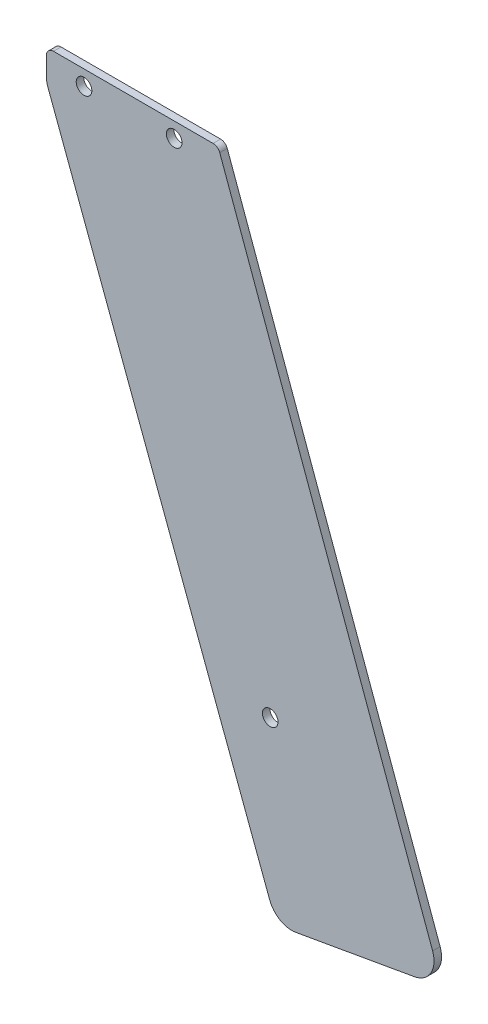
ISO-10303-21;
HEADER;
FILE_DESCRIPTION(('STEP AP214'),'2;1');
FILE_NAME('part.step','',(''),(''),'','','');
FILE_SCHEMA(('AUTOMOTIVE_DESIGN { 1 0 10303 214 1 1 1 1 }'));
ENDSEC;
DATA;
#1=APPLICATION_CONTEXT('core data for automotive mechanical design processes');
#2=APPLICATION_PROTOCOL_DEFINITION('international standard','automotive_design',2000,#1);
#3=PRODUCT_CONTEXT('',#1,'mechanical');
#4=PRODUCT('Part','Part','',(#3));
#5=PRODUCT_RELATED_PRODUCT_CATEGORY('part','',(#4));
#6=PRODUCT_DEFINITION_FORMATION('','',#4);
#7=PRODUCT_DEFINITION_CONTEXT('part definition',#1,'design');
#8=PRODUCT_DEFINITION('design','',#6,#7);
#9=PRODUCT_DEFINITION_SHAPE('','',#8);
#10=(LENGTH_UNIT() NAMED_UNIT(*) SI_UNIT(.MILLI.,.METRE.));
#11=(NAMED_UNIT(*) PLANE_ANGLE_UNIT() SI_UNIT($,.RADIAN.));
#12=(NAMED_UNIT(*) SI_UNIT($,.STERADIAN.) SOLID_ANGLE_UNIT());
#13=UNCERTAINTY_MEASURE_WITH_UNIT(LENGTH_MEASURE(1.E-05),#10,'distance_accuracy_value','');
#14=(GEOMETRIC_REPRESENTATION_CONTEXT(3) GLOBAL_UNCERTAINTY_ASSIGNED_CONTEXT((#13)) GLOBAL_UNIT_ASSIGNED_CONTEXT((#10,
#11,#12)) REPRESENTATION_CONTEXT('',''));
#15=CARTESIAN_POINT('',(0.,0.,0.));
#16=DIRECTION('',(0.,0.,1.));
#17=DIRECTION('',(1.,0.,0.));
#18=AXIS2_PLACEMENT_3D('',#15,#16,#17);
#19=CARTESIAN_POINT('',(0.,0.,3.175));
#20=DIRECTION('',(0.,0.,1.));
#21=DIRECTION('',(1.,0.,0.));
#22=AXIS2_PLACEMENT_3D('',#19,#20,#21);
#23=PLANE('',#22);
#24=CARTESIAN_POINT('',(94.5359337797207,-191.691292202923,3.175));
#25=DIRECTION('',(0.,0.,1.));
#26=DIRECTION('',(1.,0.,0.));
#27=AXIS2_PLACEMENT_3D('',#24,#25,#26);
#28=CIRCLE('',#27,3.3);
#29=CARTESIAN_POINT('',(97.8359337797207,-191.691292202923,3.175));
#30=VERTEX_POINT('',#29);
#31=EDGE_CURVE('E283',#30,#30,#28,.T.);
#32=ORIENTED_EDGE('',*,*,#31,.F.);
#33=EDGE_LOOP('',(#32));
#34=FACE_BOUND('',#33,.T.);
#35=CARTESIAN_POINT('',(53.9750000000011,0.,3.175));
#36=DIRECTION('',(0.,0.,1.));
#37=DIRECTION('',(1.,0.,0.));
#38=AXIS2_PLACEMENT_3D('',#35,#36,#37);
#39=CIRCLE('',#38,3.3);
#40=CARTESIAN_POINT('',(57.2750000000011,0.,3.175));
#41=VERTEX_POINT('',#40);
#42=EDGE_CURVE('E152',#41,#41,#39,.T.);
#43=ORIENTED_EDGE('',*,*,#42,.F.);
#44=EDGE_LOOP('',(#43));
#45=FACE_BOUND('',#44,.T.);
#46=DIRECTION('',(-1.,0.,0.));
#47=VECTOR('',#46,1.);
#48=CARTESIAN_POINT('',(72.4999999999932,6.34999999999678,3.175));
#49=LINE('',#48,#47);
#50=CARTESIAN_POINT('',(70.399377385364,6.34999999999677,3.175));
#51=VERTEX_POINT('',#50);
#52=CARTESIAN_POINT('',(3.00000000000095,6.34999999999661,3.175));
#53=VERTEX_POINT('',#52);
#54=EDGE_CURVE('E165',#51,#53,#49,.T.);
#55=ORIENTED_EDGE('',*,*,#54,.T.);
#56=CARTESIAN_POINT('',(3.00000000000096,3.34999999999661,3.175));
#57=DIRECTION('',(0.,0.,1.));
#58=DIRECTION('',(1.,0.,0.));
#59=AXIS2_PLACEMENT_3D('',#56,#57,#58);
#60=CIRCLE('',#59,3.);
#61=CARTESIAN_POINT('',(9.55600428183773E-13,3.34999999999656,3.175));
#62=VERTEX_POINT('',#61);
#63=EDGE_CURVE('E176',#53,#62,#60,.T.);
#64=ORIENTED_EDGE('',*,*,#63,.T.);
#65=DIRECTION('',(0.,-1.,0.));
#66=VECTOR('',#65,1.);
#67=CARTESIAN_POINT('',(9.0205620750794E-13,6.3499999999966,3.175));
#68=LINE('',#67,#66);
#69=CARTESIAN_POINT('',(1.09643577434151E-12,-4.54078696338335,3.175));
#70=VERTEX_POINT('',#69);
#71=EDGE_CURVE('E136',#62,#70,#68,.T.);
#72=ORIENTED_EDGE('',*,*,#71,.T.);
#73=CARTESIAN_POINT('',(10.0000000000011,-4.54078696338317,3.175));
#74=DIRECTION('',(0.,0.,1.));
#75=DIRECTION('',(1.,0.,0.));
#76=AXIS2_PLACEMENT_3D('',#73,#74,#75);
#77=CIRCLE('',#76,10.);
#78=CARTESIAN_POINT('',(0.633901180497817,-8.04452680864848,3.175));
#79=VERTEX_POINT('',#78);
#80=EDGE_CURVE('E177',#70,#79,#77,.T.);
#81=ORIENTED_EDGE('',*,*,#80,.T.);
#82=DIRECTION('',(0.350373984526517,-0.93660988195033,0.));
#83=VECTOR('',#82,1.);
#84=CARTESIAN_POINT('',(97.2444945958238,-266.301248169282,3.175));
#85=LINE('',#84,#83);
#86=CARTESIAN_POINT('',(94.3309920420975,-258.512955078415,3.175));
#87=VERTEX_POINT('',#86);
#88=EDGE_CURVE('E205',#79,#87,#85,.T.);
#89=ORIENTED_EDGE('',*,*,#88,.T.);
#90=CARTESIAN_POINT('',(103.697090861601,-255.00921523315,3.175));
#91=DIRECTION('',(0.,0.,1.));
#92=DIRECTION('',(1.,0.,0.));
#93=AXIS2_PLACEMENT_3D('',#90,#91,#92);
#94=CIRCLE('',#93,10.);
#95=CARTESIAN_POINT('',(105.43357263827,-264.857292763272,3.175));
#96=VERTEX_POINT('',#95);
#97=EDGE_CURVE('E171',#87,#96,#94,.T.);
#98=ORIENTED_EDGE('',*,*,#97,.T.);
#99=DIRECTION('',(0.984807753012209,0.173648177666925,0.));
#100=VECTOR('',#99,1.);
#101=CARTESIAN_POINT('',(167.244494595824,-253.95835951969,3.175));
#102=LINE('',#101,#100);
#103=CARTESIAN_POINT('',(155.508012819155,-256.02781791551,3.175));
#104=VERTEX_POINT('',#103);
#105=EDGE_CURVE('E194',#96,#104,#102,.T.);
#106=ORIENTED_EDGE('',*,*,#105,.T.);
#107=CARTESIAN_POINT('',(153.771531042485,-246.179740385388,3.175));
#108=DIRECTION('',(0.,0.,1.));
#109=DIRECTION('',(1.,0.,0.));
#110=AXIS2_PLACEMENT_3D('',#107,#108,#109);
#111=CIRCLE('',#110,10.);
#112=CARTESIAN_POINT('',(163.168457250344,-242.759538952131,3.175));
#113=VERTEX_POINT('',#112);
#114=EDGE_CURVE('E64',#104,#113,#111,.T.);
#115=ORIENTED_EDGE('',*,*,#114,.T.);
#116=DIRECTION('',(-0.342020143325667,0.939692620785909,0.));
#117=VECTOR('',#116,1.);
#118=CARTESIAN_POINT('',(72.4999999999932,6.34999999999678,3.175));
#119=LINE('',#118,#117);
#120=CARTESIAN_POINT('',(73.2184552477218,4.37606042997377,3.175));
#121=VERTEX_POINT('',#120);
#122=EDGE_CURVE('E162',#113,#121,#119,.T.);
#123=ORIENTED_EDGE('',*,*,#122,.T.);
#124=CARTESIAN_POINT('',(70.399377385364,3.34999999999677,3.175));
#125=DIRECTION('',(0.,0.,1.));
#126=DIRECTION('',(1.,0.,0.));
#127=AXIS2_PLACEMENT_3D('',#124,#125,#126);
#128=CIRCLE('',#127,3.);
#129=EDGE_CURVE('E178',#121,#51,#128,.T.);
#130=ORIENTED_EDGE('',*,*,#129,.T.);
#131=EDGE_LOOP('',(#55,#64,#72,#81,#89,#98,#106,#115,#123,#130));
#132=FACE_BOUND('',#131,.T.);
#133=CARTESIAN_POINT('',(15.8750000000011,0.,3.175));
#134=DIRECTION('',(0.,0.,1.));
#135=DIRECTION('',(1.,0.,0.));
#136=AXIS2_PLACEMENT_3D('',#133,#134,#135);
#137=CIRCLE('',#136,3.3);
#138=CARTESIAN_POINT('',(19.1750000000011,0.,3.175));
#139=VERTEX_POINT('',#138);
#140=EDGE_CURVE('E286',#139,#139,#137,.T.);
#141=ORIENTED_EDGE('',*,*,#140,.F.);
#142=EDGE_LOOP('',(#141));
#143=FACE_BOUND('',#142,.T.);
#144=ADVANCED_FACE('F41',(#34,#45,#132,#143),#23,.T.);
#145=CARTESIAN_POINT('',(0.,0.,0.));
#146=DIRECTION('',(0.,0.,1.));
#147=DIRECTION('',(1.,0.,0.));
#148=AXIS2_PLACEMENT_3D('',#145,#146,#147);
#149=PLANE('',#148);
#150=CARTESIAN_POINT('',(94.5359337797207,-191.691292202923,0.));
#151=DIRECTION('',(0.,0.,1.));
#152=DIRECTION('',(1.,0.,0.));
#153=AXIS2_PLACEMENT_3D('',#150,#151,#152);
#154=CIRCLE('',#153,3.3);
#155=CARTESIAN_POINT('',(97.8359337797207,-191.691292202923,0.));
#156=VERTEX_POINT('',#155);
#157=EDGE_CURVE('E284',#156,#156,#154,.T.);
#158=ORIENTED_EDGE('',*,*,#157,.T.);
#159=EDGE_LOOP('',(#158));
#160=FACE_BOUND('',#159,.T.);
#161=DIRECTION('',(0.,-1.,0.));
#162=VECTOR('',#161,1.);
#163=CARTESIAN_POINT('',(9.0205620750794E-13,6.3499999999966,0.));
#164=LINE('',#163,#162);
#165=CARTESIAN_POINT('',(9.55600428183773E-13,3.34999999999656,0.));
#166=VERTEX_POINT('',#165);
#167=CARTESIAN_POINT('',(1.09643577434151E-12,-4.54078696338335,0.));
#168=VERTEX_POINT('',#167);
#169=EDGE_CURVE('E140',#166,#168,#164,.T.);
#170=ORIENTED_EDGE('',*,*,#169,.F.);
#171=CARTESIAN_POINT('',(3.00000000000096,3.34999999999661,0.));
#172=DIRECTION('',(0.,0.,1.));
#173=DIRECTION('',(1.,0.,0.));
#174=AXIS2_PLACEMENT_3D('',#171,#172,#173);
#175=CIRCLE('',#174,3.);
#176=CARTESIAN_POINT('',(3.00000000000095,6.34999999999661,0.));
#177=VERTEX_POINT('',#176);
#178=EDGE_CURVE('E118',#166,#177,#175,.F.);
#179=ORIENTED_EDGE('',*,*,#178,.T.);
#180=DIRECTION('',(-1.,0.,0.));
#181=VECTOR('',#180,1.);
#182=CARTESIAN_POINT('',(72.4999999999932,6.34999999999678,0.));
#183=LINE('',#182,#181);
#184=CARTESIAN_POINT('',(70.399377385364,6.34999999999677,0.));
#185=VERTEX_POINT('',#184);
#186=EDGE_CURVE('E149',#185,#177,#183,.T.);
#187=ORIENTED_EDGE('',*,*,#186,.F.);
#188=CARTESIAN_POINT('',(70.399377385364,3.34999999999677,0.));
#189=DIRECTION('',(0.,0.,1.));
#190=DIRECTION('',(1.,0.,0.));
#191=AXIS2_PLACEMENT_3D('',#188,#189,#190);
#192=CIRCLE('',#191,3.);
#193=CARTESIAN_POINT('',(73.2184552477218,4.37606042997377,0.));
#194=VERTEX_POINT('',#193);
#195=EDGE_CURVE('E132',#185,#194,#192,.F.);
#196=ORIENTED_EDGE('',*,*,#195,.T.);
#197=DIRECTION('',(-0.342020143325667,0.939692620785909,0.));
#198=VECTOR('',#197,1.);
#199=CARTESIAN_POINT('',(72.4999999999932,6.34999999999678,0.));
#200=LINE('',#199,#198);
#201=CARTESIAN_POINT('',(163.168457250344,-242.759538952131,0.));
#202=VERTEX_POINT('',#201);
#203=EDGE_CURVE('E159',#202,#194,#200,.T.);
#204=ORIENTED_EDGE('',*,*,#203,.F.);
#205=CARTESIAN_POINT('',(153.771531042485,-246.179740385388,0.));
#206=DIRECTION('',(0.,0.,1.));
#207=DIRECTION('',(1.,0.,0.));
#208=AXIS2_PLACEMENT_3D('',#205,#206,#207);
#209=CIRCLE('',#208,10.);
#210=CARTESIAN_POINT('',(155.508012819155,-256.02781791551,0.));
#211=VERTEX_POINT('',#210);
#212=EDGE_CURVE('E143',#202,#211,#209,.F.);
#213=ORIENTED_EDGE('',*,*,#212,.T.);
#214=DIRECTION('',(0.984807753012209,0.173648177666925,0.));
#215=VECTOR('',#214,1.);
#216=CARTESIAN_POINT('',(167.244494595824,-253.95835951969,0.));
#217=LINE('',#216,#215);
#218=CARTESIAN_POINT('',(105.43357263827,-264.857292763272,0.));
#219=VERTEX_POINT('',#218);
#220=EDGE_CURVE('E155',#219,#211,#217,.T.);
#221=ORIENTED_EDGE('',*,*,#220,.F.);
#222=CARTESIAN_POINT('',(103.697090861601,-255.00921523315,0.));
#223=DIRECTION('',(0.,0.,1.));
#224=DIRECTION('',(1.,0.,0.));
#225=AXIS2_PLACEMENT_3D('',#222,#223,#224);
#226=CIRCLE('',#225,10.);
#227=CARTESIAN_POINT('',(94.3309920420975,-258.512955078415,0.));
#228=VERTEX_POINT('',#227);
#229=EDGE_CURVE('E167',#219,#228,#226,.F.);
#230=ORIENTED_EDGE('',*,*,#229,.T.);
#231=DIRECTION('',(0.350373984526517,-0.93660988195033,0.));
#232=VECTOR('',#231,1.);
#233=CARTESIAN_POINT('',(97.2444945958238,-266.301248169282,0.));
#234=LINE('',#233,#232);
#235=CARTESIAN_POINT('',(0.633901180497817,-8.04452680864848,0.));
#236=VERTEX_POINT('',#235);
#237=EDGE_CURVE('E146',#236,#228,#234,.T.);
#238=ORIENTED_EDGE('',*,*,#237,.F.);
#239=CARTESIAN_POINT('',(10.0000000000011,-4.54078696338317,0.));
#240=DIRECTION('',(0.,0.,1.));
#241=DIRECTION('',(1.,0.,0.));
#242=AXIS2_PLACEMENT_3D('',#239,#240,#241);
#243=CIRCLE('',#242,10.);
#244=EDGE_CURVE('E150',#236,#168,#243,.F.);
#245=ORIENTED_EDGE('',*,*,#244,.T.);
#246=EDGE_LOOP('',(#170,#179,#187,#196,#204,#213,#221,#230,#238,#245));
#247=FACE_BOUND('',#246,.T.);
#248=CARTESIAN_POINT('',(53.9750000000011,0.,0.));
#249=DIRECTION('',(0.,0.,1.));
#250=DIRECTION('',(1.,0.,0.));
#251=AXIS2_PLACEMENT_3D('',#248,#249,#250);
#252=CIRCLE('',#251,3.3);
#253=CARTESIAN_POINT('',(57.2750000000011,0.,0.));
#254=VERTEX_POINT('',#253);
#255=EDGE_CURVE('E220',#254,#254,#252,.T.);
#256=ORIENTED_EDGE('',*,*,#255,.T.);
#257=EDGE_LOOP('',(#256));
#258=FACE_BOUND('',#257,.T.);
#259=CARTESIAN_POINT('',(15.8750000000011,0.,0.));
#260=DIRECTION('',(0.,0.,1.));
#261=DIRECTION('',(1.,0.,0.));
#262=AXIS2_PLACEMENT_3D('',#259,#260,#261);
#263=CIRCLE('',#262,3.3);
#264=CARTESIAN_POINT('',(19.1750000000011,0.,0.));
#265=VERTEX_POINT('',#264);
#266=EDGE_CURVE('E290',#265,#265,#263,.T.);
#267=ORIENTED_EDGE('',*,*,#266,.T.);
#268=EDGE_LOOP('',(#267));
#269=FACE_BOUND('',#268,.T.);
#270=ADVANCED_FACE('F145',(#160,#247,#258,#269),#149,.F.);
#271=CARTESIAN_POINT('',(72.4999999999932,6.34999999999678,3.175));
#272=DIRECTION('',(0.,-1.,0.));
#273=DIRECTION('',(1.,0.,0.));
#274=AXIS2_PLACEMENT_3D('',#271,#272,#273);
#275=PLANE('',#274);
#276=ORIENTED_EDGE('',*,*,#186,.T.);
#277=DIRECTION('',(0.,0.,-1.));
#278=VECTOR('',#277,1.);
#279=CARTESIAN_POINT('',(3.00000000000095,6.34999999999661,3.175));
#280=LINE('',#279,#278);
#281=EDGE_CURVE('E121',#177,#53,#280,.F.);
#282=ORIENTED_EDGE('',*,*,#281,.T.);
#283=ORIENTED_EDGE('',*,*,#54,.F.);
#284=DIRECTION('',(0.,0.,-1.));
#285=VECTOR('',#284,1.);
#286=CARTESIAN_POINT('',(70.399377385364,6.34999999999677,3.175));
#287=LINE('',#286,#285);
#288=EDGE_CURVE('E128',#51,#185,#287,.T.);
#289=ORIENTED_EDGE('',*,*,#288,.T.);
#290=EDGE_LOOP('',(#276,#282,#283,#289));
#291=FACE_BOUND('',#290,.T.);
#292=ADVANCED_FACE('F213',(#291),#275,.F.);
#293=CARTESIAN_POINT('',(9.0205620750794E-13,6.3499999999966,3.175));
#294=DIRECTION('',(1.,0.,0.));
#295=DIRECTION('',(0.,1.,0.));
#296=AXIS2_PLACEMENT_3D('',#293,#294,#295);
#297=PLANE('',#296);
#298=ORIENTED_EDGE('',*,*,#71,.F.);
#299=DIRECTION('',(0.,0.,-1.));
#300=VECTOR('',#299,1.);
#301=CARTESIAN_POINT('',(9.55600428183773E-13,3.34999999999656,3.175));
#302=LINE('',#301,#300);
#303=EDGE_CURVE('E124',#62,#166,#302,.T.);
#304=ORIENTED_EDGE('',*,*,#303,.T.);
#305=ORIENTED_EDGE('',*,*,#169,.T.);
#306=DIRECTION('',(0.,0.,-1.));
#307=VECTOR('',#306,1.);
#308=CARTESIAN_POINT('',(1.09643577434151E-12,-4.54078696338335,3.175));
#309=LINE('',#308,#307);
#310=EDGE_CURVE('E142',#168,#70,#309,.F.);
#311=ORIENTED_EDGE('',*,*,#310,.T.);
#312=EDGE_LOOP('',(#298,#304,#305,#311));
#313=FACE_BOUND('',#312,.T.);
#314=ADVANCED_FACE('F137',(#313),#297,.F.);
#315=CARTESIAN_POINT('',(97.2444945958238,-266.301248169282,3.175));
#316=DIRECTION('',(0.93660988195033,0.350373984526517,0.));
#317=DIRECTION('',(-0.350373984526517,0.93660988195033,0.));
#318=AXIS2_PLACEMENT_3D('',#315,#316,#317);
#319=PLANE('',#318);
#320=ORIENTED_EDGE('',*,*,#88,.F.);
#321=DIRECTION('',(0.,0.,-1.));
#322=VECTOR('',#321,1.);
#323=CARTESIAN_POINT('',(0.633901180497776,-8.04452680864837,3.175));
#324=LINE('',#323,#322);
#325=EDGE_CURVE('E189',#79,#236,#324,.T.);
#326=ORIENTED_EDGE('',*,*,#325,.T.);
#327=ORIENTED_EDGE('',*,*,#237,.T.);
#328=DIRECTION('',(0.,0.,-1.));
#329=VECTOR('',#328,1.);
#330=CARTESIAN_POINT('',(94.3309920420975,-258.512955078415,3.175));
#331=LINE('',#330,#329);
#332=EDGE_CURVE('E187',#228,#87,#331,.F.);
#333=ORIENTED_EDGE('',*,*,#332,.T.);
#334=EDGE_LOOP('',(#320,#326,#327,#333));
#335=FACE_BOUND('',#334,.T.);
#336=ADVANCED_FACE('F230',(#335),#319,.F.);
#337=CARTESIAN_POINT('',(167.244494595824,-253.95835951969,3.175));
#338=DIRECTION('',(-0.173648177666925,0.984807753012209,0.));
#339=DIRECTION('',(-0.984807753012209,-0.173648177666925,0.));
#340=AXIS2_PLACEMENT_3D('',#337,#338,#339);
#341=PLANE('',#340);
#342=ORIENTED_EDGE('',*,*,#105,.F.);
#343=DIRECTION('',(0.,0.,-1.));
#344=VECTOR('',#343,1.);
#345=CARTESIAN_POINT('',(105.43357263827,-264.857292763272,3.175));
#346=LINE('',#345,#344);
#347=EDGE_CURVE('E12',#96,#219,#346,.T.);
#348=ORIENTED_EDGE('',*,*,#347,.T.);
#349=ORIENTED_EDGE('',*,*,#220,.T.);
#350=DIRECTION('',(0.,0.,-1.));
#351=VECTOR('',#350,1.);
#352=CARTESIAN_POINT('',(155.508012819155,-256.02781791551,3.175));
#353=LINE('',#352,#351);
#354=EDGE_CURVE('E47',#211,#104,#353,.F.);
#355=ORIENTED_EDGE('',*,*,#354,.T.);
#356=EDGE_LOOP('',(#342,#348,#349,#355));
#357=FACE_BOUND('',#356,.T.);
#358=ADVANCED_FACE('F193',(#357),#341,.F.);
#359=CARTESIAN_POINT('',(72.4999999999932,6.34999999999678,3.175));
#360=DIRECTION('',(-0.939692620785909,-0.342020143325667,0.));
#361=DIRECTION('',(0.342020143325667,-0.939692620785909,0.));
#362=AXIS2_PLACEMENT_3D('',#359,#360,#361);
#363=PLANE('',#362);
#364=ORIENTED_EDGE('',*,*,#203,.T.);
#365=DIRECTION('',(0.,0.,-1.));
#366=VECTOR('',#365,1.);
#367=CARTESIAN_POINT('',(73.2184552477218,4.37606042997377,3.175));
#368=LINE('',#367,#366);
#369=EDGE_CURVE('E57',#194,#121,#368,.F.);
#370=ORIENTED_EDGE('',*,*,#369,.T.);
#371=ORIENTED_EDGE('',*,*,#122,.F.);
#372=DIRECTION('',(0.,0.,-1.));
#373=VECTOR('',#372,1.);
#374=CARTESIAN_POINT('',(163.168457250344,-242.759538952131,3.175));
#375=LINE('',#374,#373);
#376=EDGE_CURVE('E185',#113,#202,#375,.T.);
#377=ORIENTED_EDGE('',*,*,#376,.T.);
#378=EDGE_LOOP('',(#364,#370,#371,#377));
#379=FACE_BOUND('',#378,.T.);
#380=ADVANCED_FACE('F206',(#379),#363,.F.);
#381=CARTESIAN_POINT('',(53.9750000000011,0.,3.175));
#382=DIRECTION('',(0.,0.,-1.));
#383=DIRECTION('',(-1.,0.,0.));
#384=AXIS2_PLACEMENT_3D('',#381,#382,#383);
#385=CYLINDRICAL_SURFACE('',#384,3.3);
#386=ORIENTED_EDGE('',*,*,#42,.T.);
#387=EDGE_LOOP('',(#386));
#388=FACE_BOUND('',#387,.T.);
#389=ORIENTED_EDGE('',*,*,#255,.F.);
#390=EDGE_LOOP('',(#389));
#391=FACE_BOUND('',#390,.T.);
#392=ADVANCED_FACE('F249',(#388,#391),#385,.F.);
#393=CARTESIAN_POINT('',(15.8750000000011,0.,3.175));
#394=DIRECTION('',(0.,0.,-1.));
#395=DIRECTION('',(-1.,0.,0.));
#396=AXIS2_PLACEMENT_3D('',#393,#394,#395);
#397=CYLINDRICAL_SURFACE('',#396,3.3);
#398=ORIENTED_EDGE('',*,*,#140,.T.);
#399=EDGE_LOOP('',(#398));
#400=FACE_BOUND('',#399,.T.);
#401=ORIENTED_EDGE('',*,*,#266,.F.);
#402=EDGE_LOOP('',(#401));
#403=FACE_BOUND('',#402,.T.);
#404=ADVANCED_FACE('F263',(#400,#403),#397,.F.);
#405=CARTESIAN_POINT('',(3.00000000000096,3.34999999999661,3.175));
#406=DIRECTION('',(0.,0.,-1.));
#407=DIRECTION('',(-1.,0.,0.));
#408=AXIS2_PLACEMENT_3D('',#405,#406,#407);
#409=CYLINDRICAL_SURFACE('',#408,3.);
#410=ORIENTED_EDGE('',*,*,#63,.F.);
#411=ORIENTED_EDGE('',*,*,#281,.F.);
#412=ORIENTED_EDGE('',*,*,#178,.F.);
#413=ORIENTED_EDGE('',*,*,#303,.F.);
#414=EDGE_LOOP('',(#410,#411,#412,#413));
#415=FACE_BOUND('',#414,.T.);
#416=ADVANCED_FACE('F123',(#415),#409,.T.);
#417=CARTESIAN_POINT('',(70.399377385364,3.34999999999677,3.175));
#418=DIRECTION('',(0.,0.,-1.));
#419=DIRECTION('',(-1.,0.,0.));
#420=AXIS2_PLACEMENT_3D('',#417,#418,#419);
#421=CYLINDRICAL_SURFACE('',#420,3.);
#422=ORIENTED_EDGE('',*,*,#129,.F.);
#423=ORIENTED_EDGE('',*,*,#369,.F.);
#424=ORIENTED_EDGE('',*,*,#195,.F.);
#425=ORIENTED_EDGE('',*,*,#288,.F.);
#426=EDGE_LOOP('',(#422,#423,#424,#425));
#427=FACE_BOUND('',#426,.T.);
#428=ADVANCED_FACE('F209',(#427),#421,.T.);
#429=CARTESIAN_POINT('',(10.0000000000011,-4.54078696338317,3.175));
#430=DIRECTION('',(0.,0.,-1.));
#431=DIRECTION('',(-1.,0.,0.));
#432=AXIS2_PLACEMENT_3D('',#429,#430,#431);
#433=CYLINDRICAL_SURFACE('',#432,10.);
#434=ORIENTED_EDGE('',*,*,#80,.F.);
#435=ORIENTED_EDGE('',*,*,#310,.F.);
#436=ORIENTED_EDGE('',*,*,#244,.F.);
#437=ORIENTED_EDGE('',*,*,#325,.F.);
#438=EDGE_LOOP('',(#434,#435,#436,#437));
#439=FACE_BOUND('',#438,.T.);
#440=ADVANCED_FACE('F226',(#439),#433,.T.);
#441=CARTESIAN_POINT('',(103.697090861601,-255.00921523315,3.175));
#442=DIRECTION('',(0.,0.,-1.));
#443=DIRECTION('',(-1.,0.,0.));
#444=AXIS2_PLACEMENT_3D('',#441,#442,#443);
#445=CYLINDRICAL_SURFACE('',#444,10.);
#446=ORIENTED_EDGE('',*,*,#97,.F.);
#447=ORIENTED_EDGE('',*,*,#332,.F.);
#448=ORIENTED_EDGE('',*,*,#229,.F.);
#449=ORIENTED_EDGE('',*,*,#347,.F.);
#450=EDGE_LOOP('',(#446,#447,#448,#449));
#451=FACE_BOUND('',#450,.T.);
#452=ADVANCED_FACE('F227',(#451),#445,.T.);
#453=CARTESIAN_POINT('',(153.771531042485,-246.179740385388,3.175));
#454=DIRECTION('',(0.,0.,-1.));
#455=DIRECTION('',(-1.,0.,0.));
#456=AXIS2_PLACEMENT_3D('',#453,#454,#455);
#457=CYLINDRICAL_SURFACE('',#456,10.);
#458=ORIENTED_EDGE('',*,*,#114,.F.);
#459=ORIENTED_EDGE('',*,*,#354,.F.);
#460=ORIENTED_EDGE('',*,*,#212,.F.);
#461=ORIENTED_EDGE('',*,*,#376,.F.);
#462=EDGE_LOOP('',(#458,#459,#460,#461));
#463=FACE_BOUND('',#462,.T.);
#464=ADVANCED_FACE('F43',(#463),#457,.T.);
#465=CARTESIAN_POINT('',(94.5359337797207,-191.691292202923,0.));
#466=DIRECTION('',(0.,0.,1.));
#467=DIRECTION('',(1.,0.,0.));
#468=AXIS2_PLACEMENT_3D('',#465,#466,#467);
#469=CYLINDRICAL_SURFACE('',#468,3.3);
#470=ORIENTED_EDGE('',*,*,#157,.F.);
#471=EDGE_LOOP('',(#470));
#472=FACE_BOUND('',#471,.T.);
#473=ORIENTED_EDGE('',*,*,#31,.T.);
#474=EDGE_LOOP('',(#473));
#475=FACE_BOUND('',#474,.T.);
#476=ADVANCED_FACE('F274',(#472,#475),#469,.F.);
#477=CLOSED_SHELL('',(#144,#270,#292,#314,#336,#358,#380,#392,#404,#416,#428,#440,#452,#464,#476));
#478=MANIFOLD_SOLID_BREP('B2',#477);
#479=ADVANCED_BREP_SHAPE_REPRESENTATION('',(#18,#478),#14);
#480=SHAPE_DEFINITION_REPRESENTATION(#9,#479);
ENDSEC;
END-ISO-10303-21;
